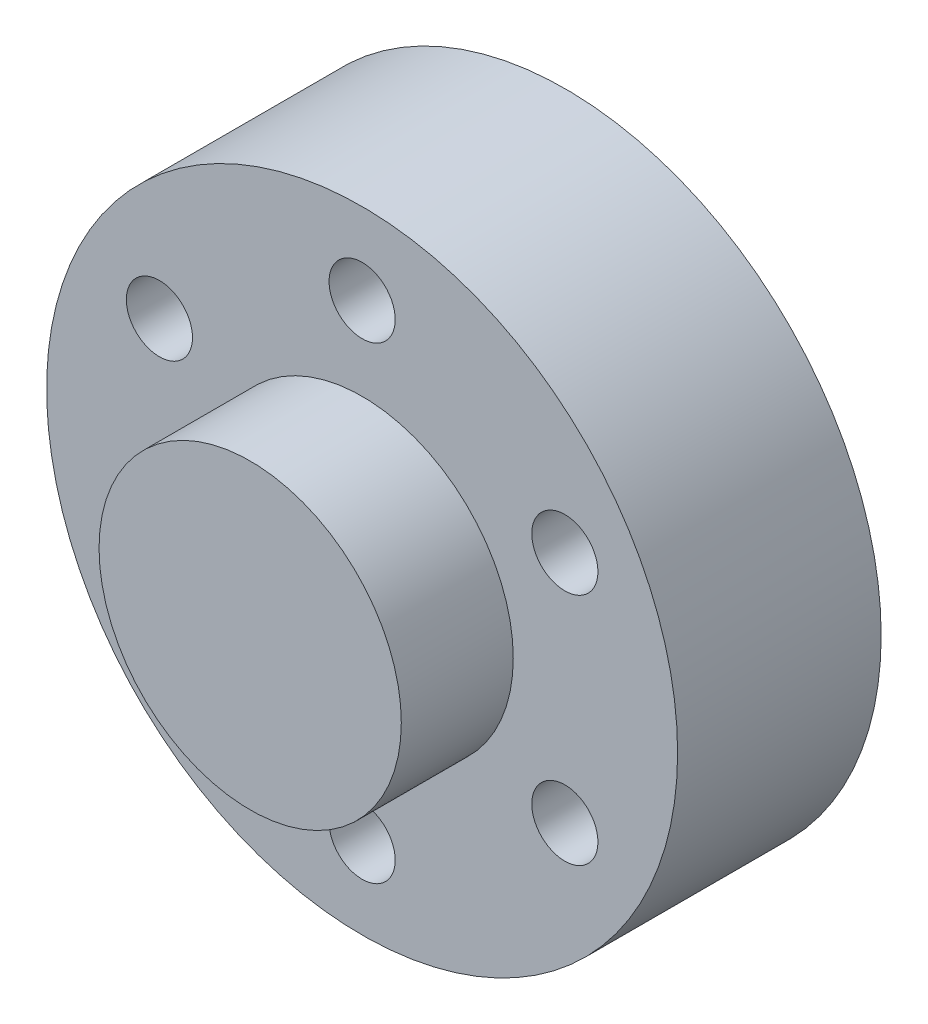
ISO-10303-21;
HEADER;
FILE_DESCRIPTION(('STEP AP214'),'2;1');
FILE_NAME('part.step','',(''),(''),'','','');
FILE_SCHEMA(('AUTOMOTIVE_DESIGN { 1 0 10303 214 1 1 1 1 }'));
ENDSEC;
DATA;
#1=APPLICATION_CONTEXT('core data for automotive mechanical design processes');
#2=APPLICATION_PROTOCOL_DEFINITION('international standard','automotive_design',2000,#1);
#3=PRODUCT_CONTEXT('',#1,'mechanical');
#4=PRODUCT('Part','Part','',(#3));
#5=PRODUCT_RELATED_PRODUCT_CATEGORY('part','',(#4));
#6=PRODUCT_DEFINITION_FORMATION('','',#4);
#7=PRODUCT_DEFINITION_CONTEXT('part definition',#1,'design');
#8=PRODUCT_DEFINITION('design','',#6,#7);
#9=PRODUCT_DEFINITION_SHAPE('','',#8);
#10=(LENGTH_UNIT() NAMED_UNIT(*) SI_UNIT(.MILLI.,.METRE.));
#11=(NAMED_UNIT(*) PLANE_ANGLE_UNIT() SI_UNIT($,.RADIAN.));
#12=(NAMED_UNIT(*) SI_UNIT($,.STERADIAN.) SOLID_ANGLE_UNIT());
#13=UNCERTAINTY_MEASURE_WITH_UNIT(LENGTH_MEASURE(1.E-05),#10,'distance_accuracy_value','');
#14=(GEOMETRIC_REPRESENTATION_CONTEXT(3) GLOBAL_UNCERTAINTY_ASSIGNED_CONTEXT((#13)) GLOBAL_UNIT_ASSIGNED_CONTEXT((#10,
#11,#12)) REPRESENTATION_CONTEXT('',''));
#15=CARTESIAN_POINT('',(0.,0.,0.));
#16=DIRECTION('',(0.,0.,1.));
#17=DIRECTION('',(1.,0.,0.));
#18=AXIS2_PLACEMENT_3D('',#15,#16,#17);
#19=CARTESIAN_POINT('',(0.,11.5,10.));
#20=DIRECTION('',(0.,0.,-1.));
#21=DIRECTION('',(-1.,0.,0.));
#22=AXIS2_PLACEMENT_3D('',#19,#20,#21);
#23=CYLINDRICAL_SURFACE('',#22,1.625);
#24=CARTESIAN_POINT('',(0.,11.5,10.));
#25=DIRECTION('',(0.,0.,1.));
#26=DIRECTION('',(1.,0.,0.));
#27=AXIS2_PLACEMENT_3D('',#24,#25,#26);
#28=CIRCLE('',#27,1.625);
#29=CARTESIAN_POINT('',(1.625,11.5,10.));
#30=VERTEX_POINT('',#29);
#31=EDGE_CURVE('E137',#30,#30,#28,.T.);
#32=ORIENTED_EDGE('',*,*,#31,.T.);
#33=EDGE_LOOP('',(#32));
#34=FACE_BOUND('',#33,.T.);
#35=CARTESIAN_POINT('',(0.,11.5,0.));
#36=DIRECTION('',(0.,0.,1.));
#37=DIRECTION('',(1.,0.,0.));
#38=AXIS2_PLACEMENT_3D('',#35,#36,#37);
#39=CIRCLE('',#38,1.625);
#40=CARTESIAN_POINT('',(1.625,11.5,0.));
#41=VERTEX_POINT('',#40);
#42=EDGE_CURVE('E164',#41,#41,#39,.T.);
#43=ORIENTED_EDGE('',*,*,#42,.F.);
#44=EDGE_LOOP('',(#43));
#45=FACE_BOUND('',#44,.T.);
#46=ADVANCED_FACE('F47',(#34,#45),#23,.F.);
#47=CARTESIAN_POINT('',(9.95929214352106,5.74999999999998,10.));
#48=DIRECTION('',(0.,0.,-1.));
#49=DIRECTION('',(-1.,0.,0.));
#50=AXIS2_PLACEMENT_3D('',#47,#48,#49);
#51=CYLINDRICAL_SURFACE('',#50,1.625);
#52=CARTESIAN_POINT('',(9.95929214352106,5.74999999999998,10.));
#53=DIRECTION('',(0.,0.,1.));
#54=DIRECTION('',(1.,0.,0.));
#55=AXIS2_PLACEMENT_3D('',#52,#53,#54);
#56=CIRCLE('',#55,1.625);
#57=CARTESIAN_POINT('',(11.5842921435211,5.74999999999998,10.));
#58=VERTEX_POINT('',#57);
#59=EDGE_CURVE('E133',#58,#58,#56,.T.);
#60=ORIENTED_EDGE('',*,*,#59,.T.);
#61=EDGE_LOOP('',(#60));
#62=FACE_BOUND('',#61,.T.);
#63=CARTESIAN_POINT('',(9.95929214352106,5.74999999999998,0.));
#64=DIRECTION('',(0.,0.,1.));
#65=DIRECTION('',(1.,0.,0.));
#66=AXIS2_PLACEMENT_3D('',#63,#64,#65);
#67=CIRCLE('',#66,1.625);
#68=CARTESIAN_POINT('',(11.5842921435211,5.74999999999998,0.));
#69=VERTEX_POINT('',#68);
#70=EDGE_CURVE('E160',#69,#69,#67,.T.);
#71=ORIENTED_EDGE('',*,*,#70,.F.);
#72=EDGE_LOOP('',(#71));
#73=FACE_BOUND('',#72,.T.);
#74=ADVANCED_FACE('F189',(#62,#73),#51,.F.);
#75=CARTESIAN_POINT('',(9.95929214352102,-5.75000000000005,10.));
#76=DIRECTION('',(0.,0.,-1.));
#77=DIRECTION('',(-1.,0.,0.));
#78=AXIS2_PLACEMENT_3D('',#75,#76,#77);
#79=CYLINDRICAL_SURFACE('',#78,1.625);
#80=CARTESIAN_POINT('',(9.95929214352102,-5.75000000000005,10.));
#81=DIRECTION('',(0.,0.,1.));
#82=DIRECTION('',(1.,0.,0.));
#83=AXIS2_PLACEMENT_3D('',#80,#81,#82);
#84=CIRCLE('',#83,1.625);
#85=CARTESIAN_POINT('',(11.584292143521,-5.75000000000005,10.));
#86=VERTEX_POINT('',#85);
#87=EDGE_CURVE('E129',#86,#86,#84,.T.);
#88=ORIENTED_EDGE('',*,*,#87,.T.);
#89=EDGE_LOOP('',(#88));
#90=FACE_BOUND('',#89,.T.);
#91=CARTESIAN_POINT('',(9.95929214352102,-5.75000000000005,0.));
#92=DIRECTION('',(0.,0.,1.));
#93=DIRECTION('',(1.,0.,0.));
#94=AXIS2_PLACEMENT_3D('',#91,#92,#93);
#95=CIRCLE('',#94,1.625);
#96=CARTESIAN_POINT('',(11.584292143521,-5.75000000000005,0.));
#97=VERTEX_POINT('',#96);
#98=EDGE_CURVE('E156',#97,#97,#95,.T.);
#99=ORIENTED_EDGE('',*,*,#98,.F.);
#100=EDGE_LOOP('',(#99));
#101=FACE_BOUND('',#100,.T.);
#102=ADVANCED_FACE('F195',(#90,#101),#79,.F.);
#103=CARTESIAN_POINT('',(0.,-11.5,10.));
#104=DIRECTION('',(0.,0.,-1.));
#105=DIRECTION('',(-1.,0.,0.));
#106=AXIS2_PLACEMENT_3D('',#103,#104,#105);
#107=CYLINDRICAL_SURFACE('',#106,1.625);
#108=CARTESIAN_POINT('',(0.,-11.5,10.));
#109=DIRECTION('',(0.,0.,1.));
#110=DIRECTION('',(1.,0.,0.));
#111=AXIS2_PLACEMENT_3D('',#108,#109,#110);
#112=CIRCLE('',#111,1.625);
#113=CARTESIAN_POINT('',(1.62499999999992,-11.5,10.));
#114=VERTEX_POINT('',#113);
#115=EDGE_CURVE('E125',#114,#114,#112,.T.);
#116=ORIENTED_EDGE('',*,*,#115,.T.);
#117=EDGE_LOOP('',(#116));
#118=FACE_BOUND('',#117,.T.);
#119=CARTESIAN_POINT('',(0.,-11.5,0.));
#120=DIRECTION('',(0.,0.,1.));
#121=DIRECTION('',(1.,0.,0.));
#122=AXIS2_PLACEMENT_3D('',#119,#120,#121);
#123=CIRCLE('',#122,1.625);
#124=CARTESIAN_POINT('',(1.62499999999992,-11.5,0.));
#125=VERTEX_POINT('',#124);
#126=EDGE_CURVE('E152',#125,#125,#123,.T.);
#127=ORIENTED_EDGE('',*,*,#126,.F.);
#128=EDGE_LOOP('',(#127));
#129=FACE_BOUND('',#128,.T.);
#130=ADVANCED_FACE('F205',(#118,#129),#107,.F.);
#131=CARTESIAN_POINT('',(-9.9592921435211,-5.74999999999991,10.));
#132=DIRECTION('',(0.,0.,-1.));
#133=DIRECTION('',(-1.,0.,0.));
#134=AXIS2_PLACEMENT_3D('',#131,#132,#133);
#135=CYLINDRICAL_SURFACE('',#134,1.625);
#136=CARTESIAN_POINT('',(-9.9592921435211,-5.74999999999991,10.));
#137=DIRECTION('',(0.,0.,1.));
#138=DIRECTION('',(1.,0.,0.));
#139=AXIS2_PLACEMENT_3D('',#136,#137,#138);
#140=CIRCLE('',#139,1.625);
#141=CARTESIAN_POINT('',(-8.3342921435211,-5.74999999999991,10.));
#142=VERTEX_POINT('',#141);
#143=EDGE_CURVE('E120',#142,#142,#140,.T.);
#144=ORIENTED_EDGE('',*,*,#143,.T.);
#145=EDGE_LOOP('',(#144));
#146=FACE_BOUND('',#145,.T.);
#147=CARTESIAN_POINT('',(-9.9592921435211,-5.74999999999991,0.));
#148=DIRECTION('',(0.,0.,1.));
#149=DIRECTION('',(1.,0.,0.));
#150=AXIS2_PLACEMENT_3D('',#147,#148,#149);
#151=CIRCLE('',#150,1.625);
#152=CARTESIAN_POINT('',(-8.3342921435211,-5.74999999999991,0.));
#153=VERTEX_POINT('',#152);
#154=EDGE_CURVE('E148',#153,#153,#151,.T.);
#155=ORIENTED_EDGE('',*,*,#154,.F.);
#156=EDGE_LOOP('',(#155));
#157=FACE_BOUND('',#156,.T.);
#158=ADVANCED_FACE('F209',(#146,#157),#135,.F.);
#159=CARTESIAN_POINT('',(-9.95929214352098,5.75000000000012,10.));
#160=DIRECTION('',(0.,0.,-1.));
#161=DIRECTION('',(-1.,0.,0.));
#162=AXIS2_PLACEMENT_3D('',#159,#160,#161);
#163=CYLINDRICAL_SURFACE('',#162,1.625);
#164=CARTESIAN_POINT('',(-9.95929214352098,5.75000000000012,10.));
#165=DIRECTION('',(0.,0.,1.));
#166=DIRECTION('',(1.,0.,0.));
#167=AXIS2_PLACEMENT_3D('',#164,#165,#166);
#168=CIRCLE('',#167,1.625);
#169=CARTESIAN_POINT('',(-8.33429214352098,5.75000000000012,10.));
#170=VERTEX_POINT('',#169);
#171=EDGE_CURVE('E116',#170,#170,#168,.T.);
#172=ORIENTED_EDGE('',*,*,#171,.T.);
#173=EDGE_LOOP('',(#172));
#174=FACE_BOUND('',#173,.T.);
#175=CARTESIAN_POINT('',(-9.95929214352098,5.75000000000012,0.));
#176=DIRECTION('',(0.,0.,1.));
#177=DIRECTION('',(1.,0.,0.));
#178=AXIS2_PLACEMENT_3D('',#175,#176,#177);
#179=CIRCLE('',#178,1.625);
#180=CARTESIAN_POINT('',(-8.33429214352098,5.75000000000012,0.));
#181=VERTEX_POINT('',#180);
#182=EDGE_CURVE('E112',#181,#181,#179,.T.);
#183=ORIENTED_EDGE('',*,*,#182,.F.);
#184=EDGE_LOOP('',(#183));
#185=FACE_BOUND('',#184,.T.);
#186=ADVANCED_FACE('F212',(#174,#185),#163,.F.);
#187=CARTESIAN_POINT('',(0.,0.,10.));
#188=DIRECTION('',(0.,0.,-1.));
#189=DIRECTION('',(-1.,0.,0.));
#190=AXIS2_PLACEMENT_3D('',#187,#188,#189);
#191=CYLINDRICAL_SURFACE('',#190,15.5);
#192=CARTESIAN_POINT('',(0.,0.,10.));
#193=DIRECTION('',(0.,0.,1.));
#194=DIRECTION('',(1.,0.,0.));
#195=AXIS2_PLACEMENT_3D('',#192,#193,#194);
#196=CIRCLE('',#195,15.5);
#197=CARTESIAN_POINT('',(15.5,0.,10.));
#198=VERTEX_POINT('',#197);
#199=EDGE_CURVE('E141',#198,#198,#196,.T.);
#200=ORIENTED_EDGE('',*,*,#199,.F.);
#201=EDGE_LOOP('',(#200));
#202=FACE_BOUND('',#201,.T.);
#203=CARTESIAN_POINT('',(0.,0.,0.));
#204=DIRECTION('',(0.,0.,1.));
#205=DIRECTION('',(1.,0.,0.));
#206=AXIS2_PLACEMENT_3D('',#203,#204,#205);
#207=CIRCLE('',#206,15.5);
#208=CARTESIAN_POINT('',(15.5,0.,0.));
#209=VERTEX_POINT('',#208);
#210=EDGE_CURVE('E121',#209,#209,#207,.T.);
#211=ORIENTED_EDGE('',*,*,#210,.T.);
#212=EDGE_LOOP('',(#211));
#213=FACE_BOUND('',#212,.T.);
#214=ADVANCED_FACE('F200',(#202,#213),#191,.T.);
#215=CARTESIAN_POINT('',(0.,0.,10.));
#216=DIRECTION('',(0.,0.,1.));
#217=DIRECTION('',(1.,0.,0.));
#218=AXIS2_PLACEMENT_3D('',#215,#216,#217);
#219=PLANE('',#218);
#220=CARTESIAN_POINT('',(0.,0.,10.));
#221=DIRECTION('',(0.,0.,1.));
#222=DIRECTION('',(1.,0.,0.));
#223=AXIS2_PLACEMENT_3D('',#220,#221,#222);
#224=CIRCLE('',#223,7.425);
#225=CARTESIAN_POINT('',(7.425,0.,10.));
#226=VERTEX_POINT('',#225);
#227=EDGE_CURVE('E107',#226,#226,#224,.T.);
#228=ORIENTED_EDGE('',*,*,#227,.F.);
#229=EDGE_LOOP('',(#228));
#230=FACE_BOUND('',#229,.T.);
#231=ORIENTED_EDGE('',*,*,#171,.F.);
#232=EDGE_LOOP('',(#231));
#233=FACE_BOUND('',#232,.T.);
#234=ORIENTED_EDGE('',*,*,#143,.F.);
#235=EDGE_LOOP('',(#234));
#236=FACE_BOUND('',#235,.T.);
#237=ORIENTED_EDGE('',*,*,#115,.F.);
#238=EDGE_LOOP('',(#237));
#239=FACE_BOUND('',#238,.T.);
#240=ORIENTED_EDGE('',*,*,#87,.F.);
#241=EDGE_LOOP('',(#240));
#242=FACE_BOUND('',#241,.T.);
#243=ORIENTED_EDGE('',*,*,#59,.F.);
#244=EDGE_LOOP('',(#243));
#245=FACE_BOUND('',#244,.T.);
#246=ORIENTED_EDGE('',*,*,#31,.F.);
#247=EDGE_LOOP('',(#246));
#248=FACE_BOUND('',#247,.T.);
#249=ORIENTED_EDGE('',*,*,#199,.T.);
#250=EDGE_LOOP('',(#249));
#251=FACE_BOUND('',#250,.T.);
#252=ADVANCED_FACE('F219',(#230,#233,#236,#239,#242,#245,#248,#251),#219,.T.);
#253=CARTESIAN_POINT('',(0.,0.,0.));
#254=DIRECTION('',(0.,0.,1.));
#255=DIRECTION('',(1.,0.,0.));
#256=AXIS2_PLACEMENT_3D('',#253,#254,#255);
#257=PLANE('',#256);
#258=CARTESIAN_POINT('',(0.,0.,0.));
#259=DIRECTION('',(0.,0.,1.));
#260=DIRECTION('',(1.,0.,0.));
#261=AXIS2_PLACEMENT_3D('',#258,#259,#260);
#262=CIRCLE('',#261,7.425);
#263=CARTESIAN_POINT('',(7.425,0.,0.));
#264=VERTEX_POINT('',#263);
#265=EDGE_CURVE('E103',#264,#264,#262,.F.);
#266=ORIENTED_EDGE('',*,*,#265,.F.);
#267=EDGE_LOOP('',(#266));
#268=FACE_BOUND('',#267,.T.);
#269=ORIENTED_EDGE('',*,*,#182,.T.);
#270=EDGE_LOOP('',(#269));
#271=FACE_BOUND('',#270,.T.);
#272=ORIENTED_EDGE('',*,*,#154,.T.);
#273=EDGE_LOOP('',(#272));
#274=FACE_BOUND('',#273,.T.);
#275=ORIENTED_EDGE('',*,*,#126,.T.);
#276=EDGE_LOOP('',(#275));
#277=FACE_BOUND('',#276,.T.);
#278=ORIENTED_EDGE('',*,*,#98,.T.);
#279=EDGE_LOOP('',(#278));
#280=FACE_BOUND('',#279,.T.);
#281=ORIENTED_EDGE('',*,*,#70,.T.);
#282=EDGE_LOOP('',(#281));
#283=FACE_BOUND('',#282,.T.);
#284=ORIENTED_EDGE('',*,*,#42,.T.);
#285=EDGE_LOOP('',(#284));
#286=FACE_BOUND('',#285,.T.);
#287=ORIENTED_EDGE('',*,*,#210,.F.);
#288=EDGE_LOOP('',(#287));
#289=FACE_BOUND('',#288,.T.);
#290=ADVANCED_FACE('F225',(#268,#271,#274,#277,#280,#283,#286,#289),#257,.F.);
#291=CARTESIAN_POINT('',(0.,0.,15.5));
#292=DIRECTION('',(0.,0.,-1.));
#293=DIRECTION('',(-1.,0.,0.));
#294=AXIS2_PLACEMENT_3D('',#291,#292,#293);
#295=CYLINDRICAL_SURFACE('',#294,7.425);
#296=CARTESIAN_POINT('',(0.,0.,15.5));
#297=DIRECTION('',(0.,0.,1.));
#298=DIRECTION('',(1.,0.,0.));
#299=AXIS2_PLACEMENT_3D('',#296,#297,#298);
#300=CIRCLE('',#299,7.425);
#301=CARTESIAN_POINT('',(7.425,0.,15.5));
#302=VERTEX_POINT('',#301);
#303=EDGE_CURVE('E108',#302,#302,#300,.T.);
#304=ORIENTED_EDGE('',*,*,#303,.F.);
#305=EDGE_LOOP('',(#304));
#306=FACE_BOUND('',#305,.T.);
#307=ORIENTED_EDGE('',*,*,#227,.T.);
#308=EDGE_LOOP('',(#307));
#309=FACE_BOUND('',#308,.T.);
#310=ADVANCED_FACE('F228',(#306,#309),#295,.T.);
#311=CARTESIAN_POINT('',(0.,0.,15.5));
#312=DIRECTION('',(0.,0.,1.));
#313=DIRECTION('',(1.,0.,0.));
#314=AXIS2_PLACEMENT_3D('',#311,#312,#313);
#315=PLANE('',#314);
#316=ORIENTED_EDGE('',*,*,#303,.T.);
#317=EDGE_LOOP('',(#316));
#318=FACE_BOUND('',#317,.T.);
#319=ADVANCED_FACE('F251',(#318),#315,.T.);
#320=CARTESIAN_POINT('',(0.,0.,-5.5));
#321=DIRECTION('',(0.,0.,1.));
#322=DIRECTION('',(1.,0.,0.));
#323=AXIS2_PLACEMENT_3D('',#320,#321,#322);
#324=CYLINDRICAL_SURFACE('',#323,7.425);
#325=CARTESIAN_POINT('',(0.,0.,-5.5));
#326=DIRECTION('',(0.,0.,-1.));
#327=DIRECTION('',(-1.,0.,0.));
#328=AXIS2_PLACEMENT_3D('',#325,#326,#327);
#329=CIRCLE('',#328,7.425);
#330=CARTESIAN_POINT('',(-7.425,0.,-5.5));
#331=VERTEX_POINT('',#330);
#332=EDGE_CURVE('E80',#331,#331,#329,.T.);
#333=ORIENTED_EDGE('',*,*,#332,.F.);
#334=EDGE_LOOP('',(#333));
#335=FACE_BOUND('',#334,.T.);
#336=ORIENTED_EDGE('',*,*,#265,.T.);
#337=EDGE_LOOP('',(#336));
#338=FACE_BOUND('',#337,.T.);
#339=ADVANCED_FACE('F260',(#335,#338),#324,.T.);
#340=CARTESIAN_POINT('',(0.,0.,-5.5));
#341=DIRECTION('',(0.,0.,-1.));
#342=DIRECTION('',(-1.,0.,0.));
#343=AXIS2_PLACEMENT_3D('',#340,#341,#342);
#344=PLANE('',#343);
#345=CARTESIAN_POINT('',(0.,0.,-5.5));
#346=DIRECTION('',(0.,0.,-1.));
#347=DIRECTION('',(-1.,0.,0.));
#348=AXIS2_PLACEMENT_3D('',#345,#346,#347);
#349=CIRCLE('',#348,2.);
#350=CARTESIAN_POINT('',(-2.,0.,-5.5));
#351=VERTEX_POINT('',#350);
#352=EDGE_CURVE('E99',#351,#351,#349,.T.);
#353=ORIENTED_EDGE('',*,*,#352,.F.);
#354=EDGE_LOOP('',(#353));
#355=FACE_BOUND('',#354,.T.);
#356=ORIENTED_EDGE('',*,*,#332,.T.);
#357=EDGE_LOOP('',(#356));
#358=FACE_BOUND('',#357,.T.);
#359=ADVANCED_FACE('F263',(#355,#358),#344,.T.);
#360=CARTESIAN_POINT('',(0.,0.,-6.5));
#361=DIRECTION('',(0.,0.,1.));
#362=DIRECTION('',(1.,0.,0.));
#363=AXIS2_PLACEMENT_3D('',#360,#361,#362);
#364=CYLINDRICAL_SURFACE('',#363,2.);
#365=CARTESIAN_POINT('',(0.,0.,-6.45));
#366=DIRECTION('',(0.,0.,-1.));
#367=DIRECTION('',(-1.,0.,0.));
#368=AXIS2_PLACEMENT_3D('',#365,#366,#367);
#369=CIRCLE('',#368,2.);
#370=CARTESIAN_POINT('',(-2.,0.,-6.45));
#371=VERTEX_POINT('',#370);
#372=EDGE_CURVE('E11',#371,#371,#369,.F.);
#373=ORIENTED_EDGE('',*,*,#372,.T.);
#374=EDGE_LOOP('',(#373));
#375=FACE_BOUND('',#374,.T.);
#376=ORIENTED_EDGE('',*,*,#352,.T.);
#377=EDGE_LOOP('',(#376));
#378=FACE_BOUND('',#377,.T.);
#379=ADVANCED_FACE('F185',(#375,#378),#364,.T.);
#380=CARTESIAN_POINT('',(0.,0.,-6.5));
#381=DIRECTION('',(0.,0.,-1.));
#382=DIRECTION('',(-1.,0.,0.));
#383=AXIS2_PLACEMENT_3D('',#380,#381,#382);
#384=PLANE('',#383);
#385=CARTESIAN_POINT('',(0.,0.,-6.5));
#386=DIRECTION('',(0.,0.,-1.));
#387=DIRECTION('',(-1.,0.,0.));
#388=AXIS2_PLACEMENT_3D('',#385,#386,#387);
#389=CIRCLE('',#388,1.75);
#390=CARTESIAN_POINT('',(1.22474487139159,1.25,-6.5));
#391=VERTEX_POINT('',#390);
#392=CARTESIAN_POINT('',(-1.22474487139159,1.25,-6.5));
#393=VERTEX_POINT('',#392);
#394=EDGE_CURVE('E63',#391,#393,#389,.T.);
#395=ORIENTED_EDGE('',*,*,#394,.F.);
#396=DIRECTION('',(1.,0.,0.));
#397=VECTOR('',#396,1.);
#398=CARTESIAN_POINT('',(1.22474487139159,1.25,-6.5));
#399=LINE('',#398,#397);
#400=EDGE_CURVE('E84',#393,#391,#399,.T.);
#401=ORIENTED_EDGE('',*,*,#400,.F.);
#402=EDGE_LOOP('',(#395,#401));
#403=FACE_BOUND('',#402,.T.);
#404=CARTESIAN_POINT('',(0.,0.,-6.5));
#405=DIRECTION('',(0.,0.,-1.));
#406=DIRECTION('',(-1.,0.,0.));
#407=AXIS2_PLACEMENT_3D('',#404,#405,#406);
#408=CIRCLE('',#407,1.95);
#409=CARTESIAN_POINT('',(-1.95,0.,-6.5));
#410=VERTEX_POINT('',#409);
#411=EDGE_CURVE('E56',#410,#410,#408,.T.);
#412=ORIENTED_EDGE('',*,*,#411,.T.);
#413=EDGE_LOOP('',(#412));
#414=FACE_BOUND('',#413,.T.);
#415=ADVANCED_FACE('F89',(#403,#414),#384,.T.);
#416=CARTESIAN_POINT('',(0.,0.,-6.45));
#417=DIRECTION('',(0.,0.,-1.));
#418=DIRECTION('',(-1.,0.,0.));
#419=AXIS2_PLACEMENT_3D('',#416,#417,#418);
#420=TOROIDAL_SURFACE('',#419,1.95,0.05);
#421=ORIENTED_EDGE('',*,*,#372,.F.);
#422=EDGE_LOOP('',(#421));
#423=FACE_BOUND('',#422,.T.);
#424=ORIENTED_EDGE('',*,*,#411,.F.);
#425=EDGE_LOOP('',(#424));
#426=FACE_BOUND('',#425,.T.);
#427=ADVANCED_FACE('F49',(#423,#426),#420,.T.);
#428=CARTESIAN_POINT('',(0.,0.,4.5));
#429=DIRECTION('',(0.,0.,-1.));
#430=DIRECTION('',(-1.,0.,0.));
#431=AXIS2_PLACEMENT_3D('',#428,#429,#430);
#432=CYLINDRICAL_SURFACE('',#431,1.75);
#433=ORIENTED_EDGE('',*,*,#394,.T.);
#434=DIRECTION('',(0.,0.,-1.));
#435=VECTOR('',#434,1.);
#436=CARTESIAN_POINT('',(-1.22474487139159,1.25,4.5));
#437=LINE('',#436,#435);
#438=CARTESIAN_POINT('',(-1.22474487139159,1.25,4.5));
#439=VERTEX_POINT('',#438);
#440=EDGE_CURVE('E81',#439,#393,#437,.T.);
#441=ORIENTED_EDGE('',*,*,#440,.F.);
#442=CARTESIAN_POINT('',(0.,0.,4.5));
#443=DIRECTION('',(0.,0.,-1.));
#444=DIRECTION('',(-1.,0.,0.));
#445=AXIS2_PLACEMENT_3D('',#442,#443,#444);
#446=CIRCLE('',#445,1.75);
#447=CARTESIAN_POINT('',(1.22474487139159,1.25,4.5));
#448=VERTEX_POINT('',#447);
#449=EDGE_CURVE('E77',#448,#439,#446,.T.);
#450=ORIENTED_EDGE('',*,*,#449,.F.);
#451=DIRECTION('',(0.,0.,-1.));
#452=VECTOR('',#451,1.);
#453=CARTESIAN_POINT('',(1.22474487139159,1.25,4.5));
#454=LINE('',#453,#452);
#455=EDGE_CURVE('E71',#448,#391,#454,.T.);
#456=ORIENTED_EDGE('',*,*,#455,.T.);
#457=EDGE_LOOP('',(#433,#441,#450,#456));
#458=FACE_BOUND('',#457,.T.);
#459=ADVANCED_FACE('F75',(#458),#432,.F.);
#460=CARTESIAN_POINT('',(1.22474487139159,1.25,4.5));
#461=DIRECTION('',(0.,1.,0.));
#462=DIRECTION('',(0.,0.,1.));
#463=AXIS2_PLACEMENT_3D('',#460,#461,#462);
#464=PLANE('',#463);
#465=ORIENTED_EDGE('',*,*,#400,.T.);
#466=ORIENTED_EDGE('',*,*,#455,.F.);
#467=DIRECTION('',(1.,0.,0.));
#468=VECTOR('',#467,1.);
#469=CARTESIAN_POINT('',(1.22474487139159,1.25,4.5));
#470=LINE('',#469,#468);
#471=EDGE_CURVE('E94',#439,#448,#470,.T.);
#472=ORIENTED_EDGE('',*,*,#471,.F.);
#473=ORIENTED_EDGE('',*,*,#440,.T.);
#474=EDGE_LOOP('',(#465,#466,#472,#473));
#475=FACE_BOUND('',#474,.T.);
#476=ADVANCED_FACE('F85',(#475),#464,.F.);
#477=CARTESIAN_POINT('',(0.,0.,4.5));
#478=DIRECTION('',(0.,0.,-1.));
#479=DIRECTION('',(-1.,0.,0.));
#480=AXIS2_PLACEMENT_3D('',#477,#478,#479);
#481=PLANE('',#480);
#482=ORIENTED_EDGE('',*,*,#449,.T.);
#483=ORIENTED_EDGE('',*,*,#471,.T.);
#484=EDGE_LOOP('',(#482,#483));
#485=FACE_BOUND('',#484,.T.);
#486=ADVANCED_FACE('F272',(#485),#481,.T.);
#487=CLOSED_SHELL('',(#46,#74,#102,#130,#158,#186,#214,#252,#290,#310,#319,#339,#359,#379,#415,
#427,#459,#476,#486));
#488=MANIFOLD_SOLID_BREP('B2',#487);
#489=ADVANCED_BREP_SHAPE_REPRESENTATION('',(#18,#488),#14);
#490=SHAPE_DEFINITION_REPRESENTATION(#9,#489);
ENDSEC;
END-ISO-10303-21;
